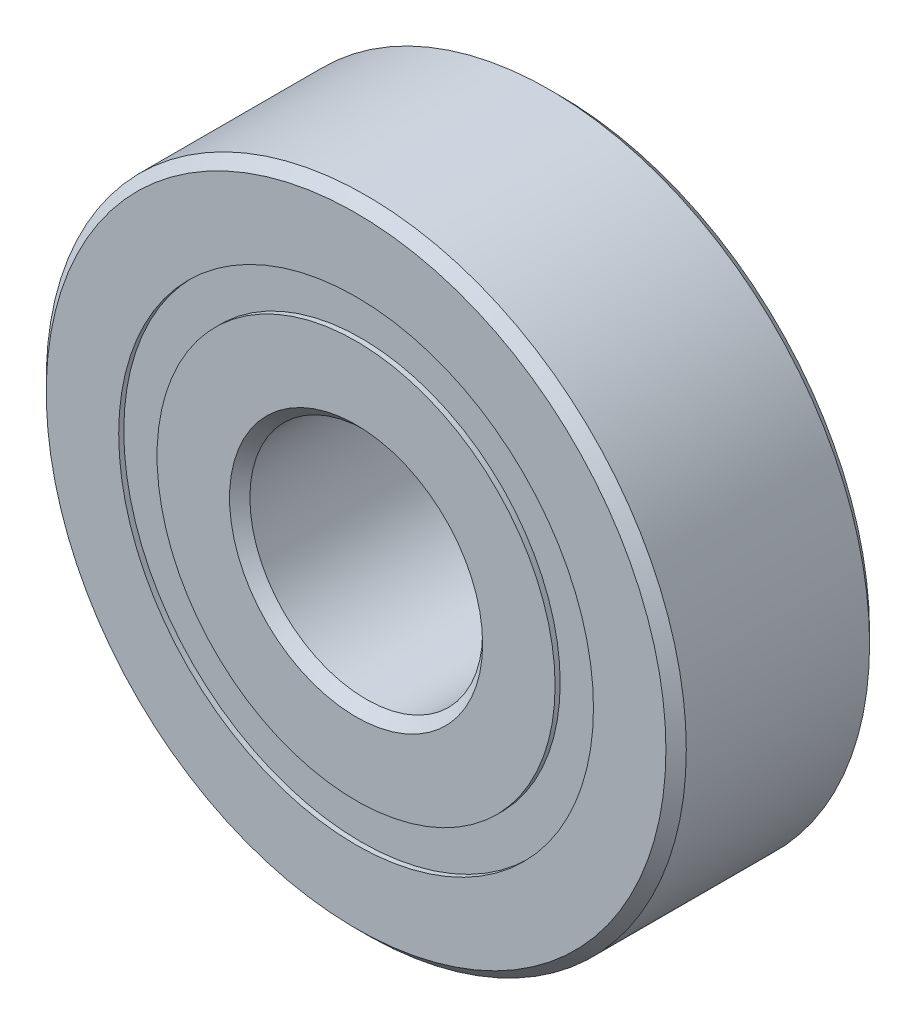
ISO-10303-21;
HEADER;
FILE_DESCRIPTION(('STEP AP214'),'2;1');
FILE_NAME('part.step','',(''),(''),'','','');
FILE_SCHEMA(('AUTOMOTIVE_DESIGN { 1 0 10303 214 1 1 1 1 }'));
ENDSEC;
DATA;
#1=APPLICATION_CONTEXT('core data for automotive mechanical design processes');
#2=APPLICATION_PROTOCOL_DEFINITION('international standard','automotive_design',2000,#1);
#3=PRODUCT_CONTEXT('',#1,'mechanical');
#4=PRODUCT('Part','Part','',(#3));
#5=PRODUCT_RELATED_PRODUCT_CATEGORY('part','',(#4));
#6=PRODUCT_DEFINITION_FORMATION('','',#4);
#7=PRODUCT_DEFINITION_CONTEXT('part definition',#1,'design');
#8=PRODUCT_DEFINITION('design','',#6,#7);
#9=PRODUCT_DEFINITION_SHAPE('','',#8);
#10=(LENGTH_UNIT() NAMED_UNIT(*) SI_UNIT(.MILLI.,.METRE.));
#11=(NAMED_UNIT(*) PLANE_ANGLE_UNIT() SI_UNIT($,.RADIAN.));
#12=(NAMED_UNIT(*) SI_UNIT($,.STERADIAN.) SOLID_ANGLE_UNIT());
#13=UNCERTAINTY_MEASURE_WITH_UNIT(LENGTH_MEASURE(1.E-05),#10,'distance_accuracy_value','');
#14=(GEOMETRIC_REPRESENTATION_CONTEXT(3) GLOBAL_UNCERTAINTY_ASSIGNED_CONTEXT((#13)) GLOBAL_UNIT_ASSIGNED_CONTEXT((#10,
#11,#12)) REPRESENTATION_CONTEXT('',''));
#15=CARTESIAN_POINT('',(0.,0.,0.));
#16=DIRECTION('',(0.,0.,1.));
#17=DIRECTION('',(1.,0.,0.));
#18=AXIS2_PLACEMENT_3D('',#15,#16,#17);
#19=CARTESIAN_POINT('',(0.,8.15934065934065,-3.32500000000001));
#20=DIRECTION('',(0.,0.,1.));
#21=DIRECTION('',(1.,0.,0.));
#22=AXIS2_PLACEMENT_3D('',#19,#20,#21);
#23=PLANE('',#22);
#24=CARTESIAN_POINT('',(0.,0.,-3.32500000000001));
#25=DIRECTION('',(0.,0.,1.));
#26=DIRECTION('',(1.,0.,0.));
#27=AXIS2_PLACEMENT_3D('',#24,#25,#26);
#28=CIRCLE('',#27,8.15934065934065);
#29=CARTESIAN_POINT('',(8.15934065934065,0.,-3.32500000000001));
#30=VERTEX_POINT('',#29);
#31=EDGE_CURVE('E59',#30,#30,#28,.T.);
#32=ORIENTED_EDGE('',*,*,#31,.F.);
#33=EDGE_LOOP('',(#32));
#34=FACE_BOUND('',#33,.T.);
#35=CARTESIAN_POINT('',(0.,0.,-3.32500000000001));
#36=DIRECTION('',(0.,0.,1.));
#37=DIRECTION('',(1.,0.,0.));
#38=AXIS2_PLACEMENT_3D('',#35,#36,#37);
#39=CIRCLE('',#38,6.84065934065934);
#40=CARTESIAN_POINT('',(6.84065934065934,0.,-3.32500000000001));
#41=VERTEX_POINT('',#40);
#42=EDGE_CURVE('E11',#41,#41,#39,.T.);
#43=ORIENTED_EDGE('',*,*,#42,.T.);
#44=EDGE_LOOP('',(#43));
#45=FACE_BOUND('',#44,.T.);
#46=ADVANCED_FACE('F45',(#34,#45),#23,.F.);
#47=CARTESIAN_POINT('',(0.,0.,3.5));
#48=DIRECTION('',(0.,0.,1.));
#49=DIRECTION('',(1.,0.,0.));
#50=AXIS2_PLACEMENT_3D('',#47,#48,#49);
#51=CYLINDRICAL_SURFACE('',#50,6.84065934065934);
#52=ORIENTED_EDGE('',*,*,#42,.F.);
#53=EDGE_LOOP('',(#52));
#54=FACE_BOUND('',#53,.T.);
#55=CARTESIAN_POINT('',(0.,0.,-1.68952158656809));
#56=DIRECTION('',(0.,0.,1.));
#57=DIRECTION('',(1.,0.,0.));
#58=AXIS2_PLACEMENT_3D('',#55,#56,#57);
#59=CIRCLE('',#58,6.84065934065934);
#60=CARTESIAN_POINT('',(6.84065934065934,0.,-1.68952158656809));
#61=VERTEX_POINT('',#60);
#62=EDGE_CURVE('E51',#61,#61,#59,.T.);
#63=ORIENTED_EDGE('',*,*,#62,.T.);
#64=EDGE_LOOP('',(#63));
#65=FACE_BOUND('',#64,.T.);
#66=ADVANCED_FACE('F68',(#54,#65),#51,.F.);
#67=CARTESIAN_POINT('',(0.,8.15934065934065,-1.68952158656809));
#68=DIRECTION('',(0.,0.,-1.));
#69=DIRECTION('',(-1.,0.,0.));
#70=AXIS2_PLACEMENT_3D('',#67,#68,#69);
#71=PLANE('',#70);
#72=ORIENTED_EDGE('',*,*,#62,.F.);
#73=EDGE_LOOP('',(#72));
#74=FACE_BOUND('',#73,.T.);
#75=CARTESIAN_POINT('',(0.,0.,-1.68952158656809));
#76=DIRECTION('',(0.,0.,1.));
#77=DIRECTION('',(1.,0.,0.));
#78=AXIS2_PLACEMENT_3D('',#75,#76,#77);
#79=CIRCLE('',#78,8.15934065934065);
#80=CARTESIAN_POINT('',(8.15934065934065,0.,-1.68952158656809));
#81=VERTEX_POINT('',#80);
#82=EDGE_CURVE('E55',#81,#81,#79,.T.);
#83=ORIENTED_EDGE('',*,*,#82,.T.);
#84=EDGE_LOOP('',(#83));
#85=FACE_BOUND('',#84,.T.);
#86=ADVANCED_FACE('F72',(#74,#85),#71,.F.);
#87=CARTESIAN_POINT('',(0.,0.,3.5));
#88=DIRECTION('',(0.,0.,1.));
#89=DIRECTION('',(1.,0.,0.));
#90=AXIS2_PLACEMENT_3D('',#87,#88,#89);
#91=CYLINDRICAL_SURFACE('',#90,8.15934065934065);
#92=ORIENTED_EDGE('',*,*,#82,.F.);
#93=EDGE_LOOP('',(#92));
#94=FACE_BOUND('',#93,.T.);
#95=ORIENTED_EDGE('',*,*,#31,.T.);
#96=EDGE_LOOP('',(#95));
#97=FACE_BOUND('',#96,.T.);
#98=ADVANCED_FACE('F65',(#94,#97),#91,.T.);
#99=CLOSED_SHELL('',(#46,#66,#86,#98));
#100=MANIFOLD_SOLID_BREP('B2_NOT_SHOWN',#99);
#101=CARTESIAN_POINT('',(0.,8.15934065934065,3.32499999999999));
#102=DIRECTION('',(0.,0.,-1.));
#103=DIRECTION('',(-1.,0.,0.));
#104=AXIS2_PLACEMENT_3D('',#101,#102,#103);
#105=PLANE('',#104);
#106=CARTESIAN_POINT('',(0.,0.,3.32499999999999));
#107=DIRECTION('',(0.,0.,1.));
#108=DIRECTION('',(1.,0.,0.));
#109=AXIS2_PLACEMENT_3D('',#106,#107,#108);
#110=CIRCLE('',#109,6.84065934065934);
#111=CARTESIAN_POINT('',(6.84065934065934,0.,3.32499999999999));
#112=VERTEX_POINT('',#111);
#113=EDGE_CURVE('E44',#112,#112,#110,.T.);
#114=ORIENTED_EDGE('',*,*,#113,.F.);
#115=EDGE_LOOP('',(#114));
#116=FACE_BOUND('',#115,.T.);
#117=CARTESIAN_POINT('',(0.,0.,3.32499999999999));
#118=DIRECTION('',(0.,0.,1.));
#119=DIRECTION('',(1.,0.,0.));
#120=AXIS2_PLACEMENT_3D('',#117,#118,#119);
#121=CIRCLE('',#120,8.15934065934065);
#122=CARTESIAN_POINT('',(8.15934065934065,0.,3.32499999999999));
#123=VERTEX_POINT('',#122);
#124=EDGE_CURVE('E126',#123,#123,#121,.T.);
#125=ORIENTED_EDGE('',*,*,#124,.T.);
#126=EDGE_LOOP('',(#125));
#127=FACE_BOUND('',#126,.T.);
#128=ADVANCED_FACE('F112',(#116,#127),#105,.F.);
#129=CARTESIAN_POINT('',(0.,0.,3.5));
#130=DIRECTION('',(0.,0.,1.));
#131=DIRECTION('',(1.,0.,0.));
#132=AXIS2_PLACEMENT_3D('',#129,#130,#131);
#133=CYLINDRICAL_SURFACE('',#132,6.84065934065934);
#134=CARTESIAN_POINT('',(0.,0.,1.68952158656808));
#135=DIRECTION('',(0.,0.,1.));
#136=DIRECTION('',(1.,0.,0.));
#137=AXIS2_PLACEMENT_3D('',#134,#135,#136);
#138=CIRCLE('',#137,6.84065934065934);
#139=CARTESIAN_POINT('',(6.84065934065934,0.,1.68952158656808));
#140=VERTEX_POINT('',#139);
#141=EDGE_CURVE('E118',#140,#140,#138,.T.);
#142=ORIENTED_EDGE('',*,*,#141,.F.);
#143=EDGE_LOOP('',(#142));
#144=FACE_BOUND('',#143,.T.);
#145=ORIENTED_EDGE('',*,*,#113,.T.);
#146=EDGE_LOOP('',(#145));
#147=FACE_BOUND('',#146,.T.);
#148=ADVANCED_FACE('F141',(#144,#147),#133,.F.);
#149=CARTESIAN_POINT('',(0.,8.15934065934065,1.68952158656808));
#150=DIRECTION('',(0.,0.,1.));
#151=DIRECTION('',(1.,0.,0.));
#152=AXIS2_PLACEMENT_3D('',#149,#150,#151);
#153=PLANE('',#152);
#154=CARTESIAN_POINT('',(0.,0.,1.68952158656808));
#155=DIRECTION('',(0.,0.,1.));
#156=DIRECTION('',(1.,0.,0.));
#157=AXIS2_PLACEMENT_3D('',#154,#155,#156);
#158=CIRCLE('',#157,8.15934065934065);
#159=CARTESIAN_POINT('',(8.15934065934065,0.,1.68952158656808));
#160=VERTEX_POINT('',#159);
#161=EDGE_CURVE('E122',#160,#160,#158,.T.);
#162=ORIENTED_EDGE('',*,*,#161,.F.);
#163=EDGE_LOOP('',(#162));
#164=FACE_BOUND('',#163,.T.);
#165=ORIENTED_EDGE('',*,*,#141,.T.);
#166=EDGE_LOOP('',(#165));
#167=FACE_BOUND('',#166,.T.);
#168=ADVANCED_FACE('F136',(#164,#167),#153,.F.);
#169=CARTESIAN_POINT('',(0.,0.,3.5));
#170=DIRECTION('',(0.,0.,1.));
#171=DIRECTION('',(1.,0.,0.));
#172=AXIS2_PLACEMENT_3D('',#169,#170,#171);
#173=CYLINDRICAL_SURFACE('',#172,8.15934065934065);
#174=ORIENTED_EDGE('',*,*,#124,.F.);
#175=EDGE_LOOP('',(#174));
#176=FACE_BOUND('',#175,.T.);
#177=ORIENTED_EDGE('',*,*,#161,.T.);
#178=EDGE_LOOP('',(#177));
#179=FACE_BOUND('',#178,.T.);
#180=ADVANCED_FACE('F133',(#176,#179),#173,.T.);
#181=CLOSED_SHELL('',(#128,#148,#168,#180));
#182=MANIFOLD_SOLID_BREP('B6_NOT_SHOWN',#181);
#183=CARTESIAN_POINT('',(0.,7.49999999999999,0.));
#184=DIRECTION('',(0.,0.,1.));
#185=DIRECTION('',(0.,1.,0.));
#186=AXIS2_PLACEMENT_3D('',#183,#184,#185);
#187=SPHERICAL_SURFACE('',#186,1.68952158656808);
#188=CARTESIAN_POINT('',(0.,7.49999999999999,1.68952158656808));
#189=VERTEX_POINT('',#188);
#190=VERTEX_LOOP('',#189);
#191=FACE_BOUND('',#190,.T.);
#192=ADVANCED_FACE('F181',(#191),#187,.T.);
#193=CLOSED_SHELL('',(#192));
#194=MANIFOLD_SOLID_BREP('B39',#193);
#195=CARTESIAN_POINT('',(0.,6.84065934065934,3.50000000000001));
#196=DIRECTION('',(0.,0.,-1.));
#197=DIRECTION('',(-1.,0.,0.));
#198=AXIS2_PLACEMENT_3D('',#195,#196,#197);
#199=PLANE('',#198);
#200=CARTESIAN_POINT('',(0.,0.,3.50000000000001));
#201=DIRECTION('',(0.,0.,1.));
#202=DIRECTION('',(1.,0.,0.));
#203=AXIS2_PLACEMENT_3D('',#200,#201,#202);
#204=CIRCLE('',#203,4.35);
#205=CARTESIAN_POINT('',(4.35,0.,3.50000000000001));
#206=VERTEX_POINT('',#205);
#207=EDGE_CURVE('E228',#206,#206,#204,.T.);
#208=ORIENTED_EDGE('',*,*,#207,.F.);
#209=EDGE_LOOP('',(#208));
#210=FACE_BOUND('',#209,.T.);
#211=CARTESIAN_POINT('',(0.,0.,3.50000000000001));
#212=DIRECTION('',(0.,0.,1.));
#213=DIRECTION('',(1.,0.,0.));
#214=AXIS2_PLACEMENT_3D('',#211,#212,#213);
#215=CIRCLE('',#214,6.84065934065934);
#216=CARTESIAN_POINT('',(6.84065934065934,0.,3.50000000000001));
#217=VERTEX_POINT('',#216);
#218=EDGE_CURVE('E180',#217,#217,#215,.T.);
#219=ORIENTED_EDGE('',*,*,#218,.T.);
#220=EDGE_LOOP('',(#219));
#221=FACE_BOUND('',#220,.T.);
#222=ADVANCED_FACE('F200',(#210,#221),#199,.F.);
#223=CARTESIAN_POINT('',(0.,0.,3.5));
#224=DIRECTION('',(0.,0.,1.));
#225=DIRECTION('',(1.,0.,0.));
#226=AXIS2_PLACEMENT_3D('',#223,#224,#225);
#227=CYLINDRICAL_SURFACE('',#226,6.84065934065934);
#228=ORIENTED_EDGE('',*,*,#218,.F.);
#229=EDGE_LOOP('',(#228));
#230=FACE_BOUND('',#229,.T.);
#231=CARTESIAN_POINT('',(0.,0.,1.55555555555555));
#232=DIRECTION('',(0.,0.,1.));
#233=DIRECTION('',(1.,0.,0.));
#234=AXIS2_PLACEMENT_3D('',#231,#232,#233);
#235=CIRCLE('',#234,6.84065934065935);
#236=CARTESIAN_POINT('',(6.84065934065935,0.,1.55555555555555));
#237=VERTEX_POINT('',#236);
#238=EDGE_CURVE('E206',#237,#237,#235,.T.);
#239=ORIENTED_EDGE('',*,*,#238,.T.);
#240=EDGE_LOOP('',(#239));
#241=FACE_BOUND('',#240,.T.);
#242=ADVANCED_FACE('F235',(#230,#241),#227,.T.);
#243=CARTESIAN_POINT('',(0.,0.,0.));
#244=DIRECTION('',(0.,0.,1.));
#245=DIRECTION('',(1.,0.,0.));
#246=AXIS2_PLACEMENT_3D('',#243,#244,#245);
#247=TOROIDAL_SURFACE('',#246,7.5,1.68952158656807);
#248=ORIENTED_EDGE('',*,*,#238,.F.);
#249=EDGE_LOOP('',(#248));
#250=FACE_BOUND('',#249,.T.);
#251=CARTESIAN_POINT('',(0.,0.,-1.55555555555556));
#252=DIRECTION('',(0.,0.,1.));
#253=DIRECTION('',(1.,0.,0.));
#254=AXIS2_PLACEMENT_3D('',#251,#252,#253);
#255=CIRCLE('',#254,6.84065934065934);
#256=CARTESIAN_POINT('',(6.84065934065934,0.,-1.55555555555556));
#257=VERTEX_POINT('',#256);
#258=EDGE_CURVE('E210',#257,#257,#255,.T.);
#259=ORIENTED_EDGE('',*,*,#258,.T.);
#260=EDGE_LOOP('',(#259));
#261=FACE_BOUND('',#260,.T.);
#262=ADVANCED_FACE('F239',(#250,#261),#247,.F.);
#263=CARTESIAN_POINT('',(0.,0.,3.5));
#264=DIRECTION('',(0.,0.,1.));
#265=DIRECTION('',(1.,0.,0.));
#266=AXIS2_PLACEMENT_3D('',#263,#264,#265);
#267=CYLINDRICAL_SURFACE('',#266,6.84065934065934);
#268=ORIENTED_EDGE('',*,*,#258,.F.);
#269=EDGE_LOOP('',(#268));
#270=FACE_BOUND('',#269,.T.);
#271=CARTESIAN_POINT('',(0.,0.,-3.50000000000001));
#272=DIRECTION('',(0.,0.,1.));
#273=DIRECTION('',(1.,0.,0.));
#274=AXIS2_PLACEMENT_3D('',#271,#272,#273);
#275=CIRCLE('',#274,6.84065934065934);
#276=CARTESIAN_POINT('',(6.84065934065934,0.,-3.50000000000001));
#277=VERTEX_POINT('',#276);
#278=EDGE_CURVE('E214',#277,#277,#275,.T.);
#279=ORIENTED_EDGE('',*,*,#278,.T.);
#280=EDGE_LOOP('',(#279));
#281=FACE_BOUND('',#280,.T.);
#282=ADVANCED_FACE('F244',(#270,#281),#267,.T.);
#283=CARTESIAN_POINT('',(0.,4.35,-3.50000000000001));
#284=DIRECTION('',(0.,0.,1.));
#285=DIRECTION('',(1.,0.,0.));
#286=AXIS2_PLACEMENT_3D('',#283,#284,#285);
#287=PLANE('',#286);
#288=ORIENTED_EDGE('',*,*,#278,.F.);
#289=EDGE_LOOP('',(#288));
#290=FACE_BOUND('',#289,.T.);
#291=CARTESIAN_POINT('',(0.,0.,-3.50000000000001));
#292=DIRECTION('',(0.,0.,1.));
#293=DIRECTION('',(1.,0.,0.));
#294=AXIS2_PLACEMENT_3D('',#291,#292,#293);
#295=CIRCLE('',#294,4.35);
#296=CARTESIAN_POINT('',(4.35,0.,-3.50000000000001));
#297=VERTEX_POINT('',#296);
#298=EDGE_CURVE('E219',#297,#297,#295,.T.);
#299=ORIENTED_EDGE('',*,*,#298,.T.);
#300=EDGE_LOOP('',(#299));
#301=FACE_BOUND('',#300,.T.);
#302=ADVANCED_FACE('F250',(#290,#301),#287,.F.);
#303=CARTESIAN_POINT('',(0.,0.,-3.15000000000001));
#304=DIRECTION('',(0.,0.,-1.));
#305=DIRECTION('',(-1.,0.,0.));
#306=AXIS2_PLACEMENT_3D('',#303,#304,#305);
#307=CONICAL_SURFACE('',#306,4.,0.785398163397453);
#308=ORIENTED_EDGE('',*,*,#298,.F.);
#309=EDGE_LOOP('',(#308));
#310=FACE_BOUND('',#309,.T.);
#311=CARTESIAN_POINT('',(0.,0.,-3.15000000000001));
#312=DIRECTION('',(0.,0.,1.));
#313=DIRECTION('',(1.,0.,0.));
#314=AXIS2_PLACEMENT_3D('',#311,#312,#313);
#315=CIRCLE('',#314,4.);
#316=CARTESIAN_POINT('',(4.,0.,-3.15000000000001));
#317=VERTEX_POINT('',#316);
#318=EDGE_CURVE('E222',#317,#317,#315,.T.);
#319=ORIENTED_EDGE('',*,*,#318,.T.);
#320=EDGE_LOOP('',(#319));
#321=FACE_BOUND('',#320,.T.);
#322=ADVANCED_FACE('F254',(#310,#321),#307,.F.);
#323=CARTESIAN_POINT('',(0.,0.,3.5));
#324=DIRECTION('',(0.,0.,1.));
#325=DIRECTION('',(1.,0.,0.));
#326=AXIS2_PLACEMENT_3D('',#323,#324,#325);
#327=CYLINDRICAL_SURFACE('',#326,4.);
#328=ORIENTED_EDGE('',*,*,#318,.F.);
#329=EDGE_LOOP('',(#328));
#330=FACE_BOUND('',#329,.T.);
#331=CARTESIAN_POINT('',(0.,0.,3.15000000000001));
#332=DIRECTION('',(0.,0.,1.));
#333=DIRECTION('',(1.,0.,0.));
#334=AXIS2_PLACEMENT_3D('',#331,#332,#333);
#335=CIRCLE('',#334,4.);
#336=CARTESIAN_POINT('',(4.,0.,3.15000000000001));
#337=VERTEX_POINT('',#336);
#338=EDGE_CURVE('E225',#337,#337,#335,.T.);
#339=ORIENTED_EDGE('',*,*,#338,.T.);
#340=EDGE_LOOP('',(#339));
#341=FACE_BOUND('',#340,.T.);
#342=ADVANCED_FACE('F258',(#330,#341),#327,.F.);
#343=CARTESIAN_POINT('',(0.,0.,3.50000000000001));
#344=DIRECTION('',(0.,0.,1.));
#345=DIRECTION('',(1.,0.,0.));
#346=AXIS2_PLACEMENT_3D('',#343,#344,#345);
#347=CONICAL_SURFACE('',#346,4.35,0.785398163397453);
#348=ORIENTED_EDGE('',*,*,#338,.F.);
#349=EDGE_LOOP('',(#348));
#350=FACE_BOUND('',#349,.T.);
#351=ORIENTED_EDGE('',*,*,#207,.T.);
#352=EDGE_LOOP('',(#351));
#353=FACE_BOUND('',#352,.T.);
#354=ADVANCED_FACE('F232',(#350,#353),#347,.F.);
#355=CLOSED_SHELL('',(#222,#242,#262,#282,#302,#322,#342,#354));
#356=MANIFOLD_SOLID_BREP('B108',#355);
#357=CARTESIAN_POINT('',(0.,0.,3.15));
#358=DIRECTION('',(0.,0.,-1.));
#359=DIRECTION('',(-1.,0.,0.));
#360=AXIS2_PLACEMENT_3D('',#357,#358,#359);
#361=CONICAL_SURFACE('',#360,11.,0.785398163397453);
#362=CARTESIAN_POINT('',(0.,0.,3.5));
#363=DIRECTION('',(0.,0.,1.));
#364=DIRECTION('',(1.,0.,0.));
#365=AXIS2_PLACEMENT_3D('',#362,#363,#364);
#366=CIRCLE('',#365,10.65);
#367=CARTESIAN_POINT('',(10.65,0.,3.5));
#368=VERTEX_POINT('',#367);
#369=EDGE_CURVE('E349',#368,#368,#366,.T.);
#370=ORIENTED_EDGE('',*,*,#369,.F.);
#371=EDGE_LOOP('',(#370));
#372=FACE_BOUND('',#371,.T.);
#373=CARTESIAN_POINT('',(0.,0.,3.15));
#374=DIRECTION('',(0.,0.,1.));
#375=DIRECTION('',(1.,0.,0.));
#376=AXIS2_PLACEMENT_3D('',#373,#374,#375);
#377=CIRCLE('',#376,11.);
#378=CARTESIAN_POINT('',(11.,0.,3.15));
#379=VERTEX_POINT('',#378);
#380=EDGE_CURVE('E199',#379,#379,#377,.T.);
#381=ORIENTED_EDGE('',*,*,#380,.T.);
#382=EDGE_LOOP('',(#381));
#383=FACE_BOUND('',#382,.T.);
#384=ADVANCED_FACE('F321',(#372,#383),#361,.T.);
#385=CARTESIAN_POINT('',(0.,0.,3.5));
#386=DIRECTION('',(0.,0.,1.));
#387=DIRECTION('',(1.,0.,0.));
#388=AXIS2_PLACEMENT_3D('',#385,#386,#387);
#389=CYLINDRICAL_SURFACE('',#388,11.);
#390=ORIENTED_EDGE('',*,*,#380,.F.);
#391=EDGE_LOOP('',(#390));
#392=FACE_BOUND('',#391,.T.);
#393=CARTESIAN_POINT('',(0.,0.,-3.15000000000001));
#394=DIRECTION('',(0.,0.,1.));
#395=DIRECTION('',(1.,0.,0.));
#396=AXIS2_PLACEMENT_3D('',#393,#394,#395);
#397=CIRCLE('',#396,11.);
#398=CARTESIAN_POINT('',(11.,0.,-3.15000000000001));
#399=VERTEX_POINT('',#398);
#400=EDGE_CURVE('E327',#399,#399,#397,.T.);
#401=ORIENTED_EDGE('',*,*,#400,.T.);
#402=EDGE_LOOP('',(#401));
#403=FACE_BOUND('',#402,.T.);
#404=ADVANCED_FACE('F356',(#392,#403),#389,.T.);
#405=CARTESIAN_POINT('',(0.,0.,-3.50000000000001));
#406=DIRECTION('',(0.,0.,1.));
#407=DIRECTION('',(1.,0.,0.));
#408=AXIS2_PLACEMENT_3D('',#405,#406,#407);
#409=CONICAL_SURFACE('',#408,10.65,0.785398163397453);
#410=ORIENTED_EDGE('',*,*,#400,.F.);
#411=EDGE_LOOP('',(#410));
#412=FACE_BOUND('',#411,.T.);
#413=CARTESIAN_POINT('',(0.,0.,-3.50000000000001));
#414=DIRECTION('',(0.,0.,1.));
#415=DIRECTION('',(1.,0.,0.));
#416=AXIS2_PLACEMENT_3D('',#413,#414,#415);
#417=CIRCLE('',#416,10.65);
#418=CARTESIAN_POINT('',(10.65,0.,-3.50000000000001));
#419=VERTEX_POINT('',#418);
#420=EDGE_CURVE('E331',#419,#419,#417,.T.);
#421=ORIENTED_EDGE('',*,*,#420,.T.);
#422=EDGE_LOOP('',(#421));
#423=FACE_BOUND('',#422,.T.);
#424=ADVANCED_FACE('F360',(#412,#423),#409,.T.);
#425=CARTESIAN_POINT('',(0.,10.65,-3.50000000000001));
#426=DIRECTION('',(0.,0.,1.));
#427=DIRECTION('',(1.,0.,0.));
#428=AXIS2_PLACEMENT_3D('',#425,#426,#427);
#429=PLANE('',#428);
#430=ORIENTED_EDGE('',*,*,#420,.F.);
#431=EDGE_LOOP('',(#430));
#432=FACE_BOUND('',#431,.T.);
#433=CARTESIAN_POINT('',(0.,0.,-3.50000000000001));
#434=DIRECTION('',(0.,0.,1.));
#435=DIRECTION('',(1.,0.,0.));
#436=AXIS2_PLACEMENT_3D('',#433,#434,#435);
#437=CIRCLE('',#436,8.15934065934065);
#438=CARTESIAN_POINT('',(8.15934065934065,0.,-3.50000000000001));
#439=VERTEX_POINT('',#438);
#440=EDGE_CURVE('E335',#439,#439,#437,.T.);
#441=ORIENTED_EDGE('',*,*,#440,.T.);
#442=EDGE_LOOP('',(#441));
#443=FACE_BOUND('',#442,.T.);
#444=ADVANCED_FACE('F365',(#432,#443),#429,.F.);
#445=CARTESIAN_POINT('',(0.,0.,3.5));
#446=DIRECTION('',(0.,0.,1.));
#447=DIRECTION('',(1.,0.,0.));
#448=AXIS2_PLACEMENT_3D('',#445,#446,#447);
#449=CYLINDRICAL_SURFACE('',#448,8.15934065934065);
#450=ORIENTED_EDGE('',*,*,#440,.F.);
#451=EDGE_LOOP('',(#450));
#452=FACE_BOUND('',#451,.T.);
#453=CARTESIAN_POINT('',(0.,0.,-1.55555555555556));
#454=DIRECTION('',(0.,0.,1.));
#455=DIRECTION('',(1.,0.,0.));
#456=AXIS2_PLACEMENT_3D('',#453,#454,#455);
#457=CIRCLE('',#456,8.15934065934065);
#458=CARTESIAN_POINT('',(8.15934065934065,0.,-1.55555555555556));
#459=VERTEX_POINT('',#458);
#460=EDGE_CURVE('E340',#459,#459,#457,.T.);
#461=ORIENTED_EDGE('',*,*,#460,.T.);
#462=EDGE_LOOP('',(#461));
#463=FACE_BOUND('',#462,.T.);
#464=ADVANCED_FACE('F371',(#452,#463),#449,.F.);
#465=CARTESIAN_POINT('',(0.,0.,0.));
#466=DIRECTION('',(0.,0.,1.));
#467=DIRECTION('',(1.,0.,0.));
#468=AXIS2_PLACEMENT_3D('',#465,#466,#467);
#469=TOROIDAL_SURFACE('',#468,7.49999999999999,1.68952158656808);
#470=ORIENTED_EDGE('',*,*,#460,.F.);
#471=EDGE_LOOP('',(#470));
#472=FACE_BOUND('',#471,.T.);
#473=CARTESIAN_POINT('',(0.,0.,1.55555555555555));
#474=DIRECTION('',(0.,0.,1.));
#475=DIRECTION('',(1.,0.,0.));
#476=AXIS2_PLACEMENT_3D('',#473,#474,#475);
#477=CIRCLE('',#476,8.15934065934065);
#478=CARTESIAN_POINT('',(8.15934065934065,0.,1.55555555555555));
#479=VERTEX_POINT('',#478);
#480=EDGE_CURVE('E343',#479,#479,#477,.T.);
#481=ORIENTED_EDGE('',*,*,#480,.T.);
#482=EDGE_LOOP('',(#481));
#483=FACE_BOUND('',#482,.T.);
#484=ADVANCED_FACE('F375',(#472,#483),#469,.F.);
#485=CARTESIAN_POINT('',(0.,0.,3.5));
#486=DIRECTION('',(0.,0.,1.));
#487=DIRECTION('',(1.,0.,0.));
#488=AXIS2_PLACEMENT_3D('',#485,#486,#487);
#489=CYLINDRICAL_SURFACE('',#488,8.15934065934065);
#490=ORIENTED_EDGE('',*,*,#480,.F.);
#491=EDGE_LOOP('',(#490));
#492=FACE_BOUND('',#491,.T.);
#493=CARTESIAN_POINT('',(0.,0.,3.5));
#494=DIRECTION('',(0.,0.,1.));
#495=DIRECTION('',(1.,0.,0.));
#496=AXIS2_PLACEMENT_3D('',#493,#494,#495);
#497=CIRCLE('',#496,8.15934065934065);
#498=CARTESIAN_POINT('',(8.15934065934065,0.,3.5));
#499=VERTEX_POINT('',#498);
#500=EDGE_CURVE('E346',#499,#499,#497,.T.);
#501=ORIENTED_EDGE('',*,*,#500,.T.);
#502=EDGE_LOOP('',(#501));
#503=FACE_BOUND('',#502,.T.);
#504=ADVANCED_FACE('F379',(#492,#503),#489,.F.);
#505=CARTESIAN_POINT('',(0.,10.65,3.5));
#506=DIRECTION('',(0.,0.,-1.));
#507=DIRECTION('',(-1.,0.,0.));
#508=AXIS2_PLACEMENT_3D('',#505,#506,#507);
#509=PLANE('',#508);
#510=ORIENTED_EDGE('',*,*,#500,.F.);
#511=EDGE_LOOP('',(#510));
#512=FACE_BOUND('',#511,.T.);
#513=ORIENTED_EDGE('',*,*,#369,.T.);
#514=EDGE_LOOP('',(#513));
#515=FACE_BOUND('',#514,.T.);
#516=ADVANCED_FACE('F353',(#512,#515),#509,.F.);
#517=CLOSED_SHELL('',(#384,#404,#424,#444,#464,#484,#504,#516));
#518=MANIFOLD_SOLID_BREP('B175',#517);
#519=ADVANCED_BREP_SHAPE_REPRESENTATION('',(#18,#100,#182,#194,#356,#518),#14);
#520=SHAPE_DEFINITION_REPRESENTATION(#9,#519);
ENDSEC;
END-ISO-10303-21;
